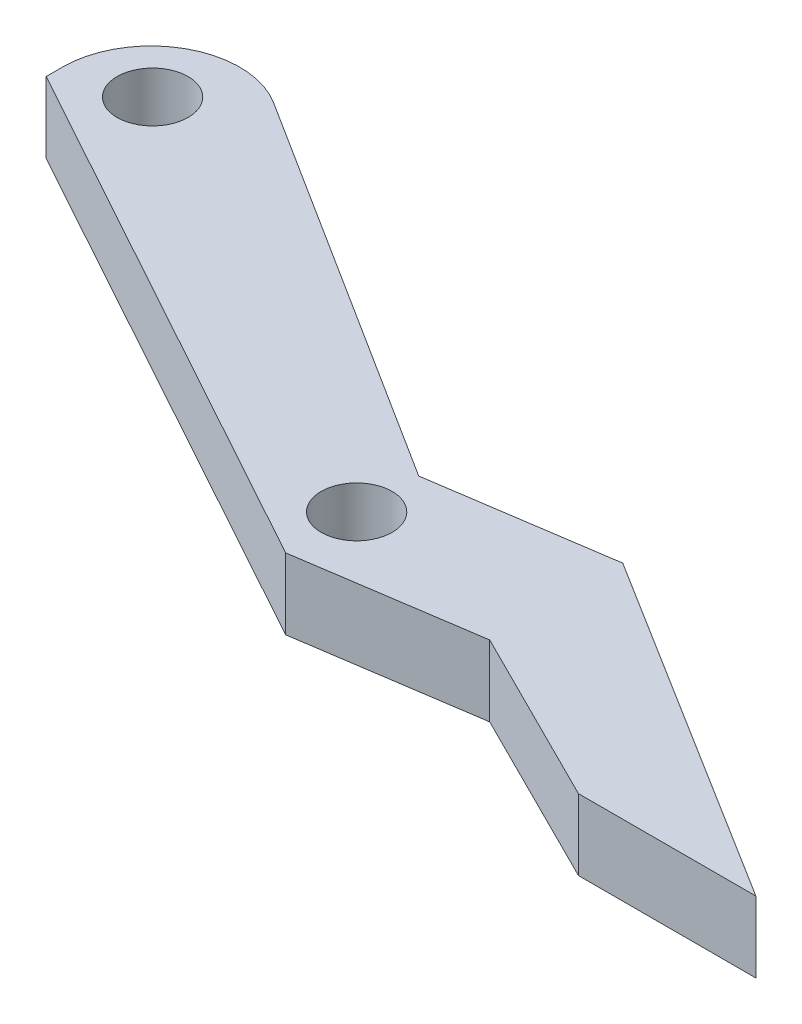
ISO-10303-21;
HEADER;
FILE_DESCRIPTION(('STEP AP214'),'2;1');
FILE_NAME('part.step','',(''),(''),'','','');
FILE_SCHEMA(('AUTOMOTIVE_DESIGN { 1 0 10303 214 1 1 1 1 }'));
ENDSEC;
DATA;
#1=APPLICATION_CONTEXT('core data for automotive mechanical design processes');
#2=APPLICATION_PROTOCOL_DEFINITION('international standard','automotive_design',2000,#1);
#3=PRODUCT_CONTEXT('',#1,'mechanical');
#4=PRODUCT('Part','Part','',(#3));
#5=PRODUCT_RELATED_PRODUCT_CATEGORY('part','',(#4));
#6=PRODUCT_DEFINITION_FORMATION('','',#4);
#7=PRODUCT_DEFINITION_CONTEXT('part definition',#1,'design');
#8=PRODUCT_DEFINITION('design','',#6,#7);
#9=PRODUCT_DEFINITION_SHAPE('','',#8);
#10=(LENGTH_UNIT() NAMED_UNIT(*) SI_UNIT(.MILLI.,.METRE.));
#11=(NAMED_UNIT(*) PLANE_ANGLE_UNIT() SI_UNIT($,.RADIAN.));
#12=(NAMED_UNIT(*) SI_UNIT($,.STERADIAN.) SOLID_ANGLE_UNIT());
#13=UNCERTAINTY_MEASURE_WITH_UNIT(LENGTH_MEASURE(1.E-05),#10,'distance_accuracy_value','');
#14=(GEOMETRIC_REPRESENTATION_CONTEXT(3) GLOBAL_UNCERTAINTY_ASSIGNED_CONTEXT((#13)) GLOBAL_UNIT_ASSIGNED_CONTEXT((#10,
#11,#12)) REPRESENTATION_CONTEXT('',''));
#15=CARTESIAN_POINT('',(0.,0.,0.));
#16=DIRECTION('',(0.,0.,1.));
#17=DIRECTION('',(1.,0.,0.));
#18=AXIS2_PLACEMENT_3D('',#15,#16,#17);
#19=CARTESIAN_POINT('',(0.,8.,0.));
#20=DIRECTION('',(0.,-1.,0.));
#21=DIRECTION('',(0.,0.,-1.));
#22=AXIS2_PLACEMENT_3D('',#19,#20,#21);
#23=PLANE('',#22);
#24=DIRECTION('',(-0.844819075554229,0.,-0.535052081184345));
#25=VECTOR('',#24,1.);
#26=CARTESIAN_POINT('',(0.,8.,-60.));
#27=LINE('',#26,#25);
#28=CARTESIAN_POINT('',(60.,8.,-22.));
#29=VERTEX_POINT('',#28);
#30=CARTESIAN_POINT('',(15.3505208118433,8.,-50.2780034858326));
#31=VERTEX_POINT('',#30);
#32=EDGE_CURVE('E125',#29,#31,#27,.T.);
#33=ORIENTED_EDGE('',*,*,#32,.T.);
#34=CARTESIAN_POINT('',(9.99999999999987,8.,-41.8298127302903));
#35=DIRECTION('',(0.,-1.,0.));
#36=DIRECTION('',(0.,0.,-1.));
#37=AXIS2_PLACEMENT_3D('',#34,#35,#36);
#38=CIRCLE('',#37,10.);
#39=CARTESIAN_POINT('',(-1.29312687655997E-13,8.,-41.8298127302903));
#40=VERTEX_POINT('',#39);
#41=EDGE_CURVE('E11',#31,#40,#38,.F.);
#42=ORIENTED_EDGE('',*,*,#41,.T.);
#43=DIRECTION('',(0.,0.,1.));
#44=VECTOR('',#43,1.);
#45=CARTESIAN_POINT('',(0.,8.,-60.));
#46=LINE('',#45,#44);
#47=CARTESIAN_POINT('',(-1.42125352285694E-13,8.,-40.0000000000001));
#48=VERTEX_POINT('',#47);
#49=EDGE_CURVE('E206',#40,#48,#46,.T.);
#50=ORIENTED_EDGE('',*,*,#49,.T.);
#51=DIRECTION('',(0.876215908676647,0.,0.481918749772156));
#52=VECTOR('',#51,1.);
#53=CARTESIAN_POINT('',(-1.42125352285694E-13,8.,-40.0000000000001));
#54=LINE('',#53,#52);
#55=CARTESIAN_POINT('',(60.,8.,-7.));
#56=VERTEX_POINT('',#55);
#57=EDGE_CURVE('E203',#48,#56,#54,.T.);
#58=ORIENTED_EDGE('',*,*,#57,.T.);
#59=DIRECTION('',(0.988936352868298,0.,-0.148340452930245));
#60=VECTOR('',#59,1.);
#61=CARTESIAN_POINT('',(80.,8.,-10.));
#62=LINE('',#61,#60);
#63=CARTESIAN_POINT('',(80.,8.,-10.));
#64=VERTEX_POINT('',#63);
#65=EDGE_CURVE('E200',#56,#64,#62,.T.);
#66=ORIENTED_EDGE('',*,*,#65,.T.);
#67=DIRECTION('',(0.894427190999916,0.,0.447213595499958));
#68=VECTOR('',#67,1.);
#69=CARTESIAN_POINT('',(100.,8.,0.));
#70=LINE('',#69,#68);
#71=CARTESIAN_POINT('',(100.,8.,0.));
#72=VERTEX_POINT('',#71);
#73=EDGE_CURVE('E197',#64,#72,#70,.T.);
#74=ORIENTED_EDGE('',*,*,#73,.T.);
#75=DIRECTION('',(1.,0.,0.));
#76=VECTOR('',#75,1.);
#77=CARTESIAN_POINT('',(120.,8.,0.));
#78=LINE('',#77,#76);
#79=CARTESIAN_POINT('',(120.,8.,0.));
#80=VERTEX_POINT('',#79);
#81=EDGE_CURVE('E131',#72,#80,#78,.T.);
#82=ORIENTED_EDGE('',*,*,#81,.T.);
#83=DIRECTION('',(-0.847998304005088,0.,-0.52999894000318));
#84=VECTOR('',#83,1.);
#85=CARTESIAN_POINT('',(80.,8.,-25.));
#86=LINE('',#85,#84);
#87=CARTESIAN_POINT('',(80.,8.,-25.));
#88=VERTEX_POINT('',#87);
#89=EDGE_CURVE('E126',#80,#88,#86,.T.);
#90=ORIENTED_EDGE('',*,*,#89,.T.);
#91=DIRECTION('',(-0.988936352868298,0.,0.148340452930245));
#92=VECTOR('',#91,1.);
#93=CARTESIAN_POINT('',(60.,8.,-22.));
#94=LINE('',#93,#92);
#95=EDGE_CURVE('E115',#88,#29,#94,.T.);
#96=ORIENTED_EDGE('',*,*,#95,.T.);
#97=EDGE_LOOP('',(#33,#42,#50,#58,#66,#74,#82,#90,#96));
#98=FACE_BOUND('',#97,.T.);
#99=CARTESIAN_POINT('',(60.,8.,-15.));
#100=DIRECTION('',(0.,1.,0.));
#101=DIRECTION('',(0.,0.,1.));
#102=AXIS2_PLACEMENT_3D('',#99,#100,#101);
#103=CIRCLE('',#102,4.00000000000001);
#104=CARTESIAN_POINT('',(60.,8.,-11.));
#105=VERTEX_POINT('',#104);
#106=EDGE_CURVE('E194',#105,#105,#103,.T.);
#107=ORIENTED_EDGE('',*,*,#106,.F.);
#108=EDGE_LOOP('',(#107));
#109=FACE_BOUND('',#108,.T.);
#110=CARTESIAN_POINT('',(7.99999999999986,8.,-44.));
#111=DIRECTION('',(0.,1.,0.));
#112=DIRECTION('',(0.,0.,1.));
#113=AXIS2_PLACEMENT_3D('',#110,#111,#112);
#114=CIRCLE('',#113,4.);
#115=CARTESIAN_POINT('',(7.99999999999986,8.,-40.));
#116=VERTEX_POINT('',#115);
#117=EDGE_CURVE('E215',#116,#116,#114,.T.);
#118=ORIENTED_EDGE('',*,*,#117,.F.);
#119=EDGE_LOOP('',(#118));
#120=FACE_BOUND('',#119,.T.);
#121=ADVANCED_FACE('F43',(#98,#109,#120),#23,.F.);
#122=CARTESIAN_POINT('',(0.,0.,0.));
#123=DIRECTION('',(0.,-1.,0.));
#124=DIRECTION('',(0.,0.,-1.));
#125=AXIS2_PLACEMENT_3D('',#122,#123,#124);
#126=PLANE('',#125);
#127=CARTESIAN_POINT('',(60.,0.,-15.));
#128=DIRECTION('',(0.,1.,0.));
#129=DIRECTION('',(0.,0.,1.));
#130=AXIS2_PLACEMENT_3D('',#127,#128,#129);
#131=CIRCLE('',#130,4.00000000000001);
#132=CARTESIAN_POINT('',(60.,0.,-11.));
#133=VERTEX_POINT('',#132);
#134=EDGE_CURVE('E211',#133,#133,#131,.T.);
#135=ORIENTED_EDGE('',*,*,#134,.T.);
#136=EDGE_LOOP('',(#135));
#137=FACE_BOUND('',#136,.T.);
#138=DIRECTION('',(0.,0.,1.));
#139=VECTOR('',#138,1.);
#140=CARTESIAN_POINT('',(0.,0.,-60.));
#141=LINE('',#140,#139);
#142=CARTESIAN_POINT('',(-1.29312687655997E-13,0.,-41.8298127302903));
#143=VERTEX_POINT('',#142);
#144=CARTESIAN_POINT('',(-1.42125352285694E-13,0.,-40.0000000000001));
#145=VERTEX_POINT('',#144);
#146=EDGE_CURVE('E183',#143,#145,#141,.T.);
#147=ORIENTED_EDGE('',*,*,#146,.F.);
#148=CARTESIAN_POINT('',(9.99999999999987,0.,-41.8298127302903));
#149=DIRECTION('',(0.,-1.,0.));
#150=DIRECTION('',(0.,0.,-1.));
#151=AXIS2_PLACEMENT_3D('',#148,#149,#150);
#152=CIRCLE('',#151,10.);
#153=CARTESIAN_POINT('',(15.3505208118433,0.,-50.2780034858326));
#154=VERTEX_POINT('',#153);
#155=EDGE_CURVE('E66',#143,#154,#152,.T.);
#156=ORIENTED_EDGE('',*,*,#155,.T.);
#157=DIRECTION('',(-0.844819075554229,0.,-0.535052081184345));
#158=VECTOR('',#157,1.);
#159=CARTESIAN_POINT('',(0.,0.,-60.));
#160=LINE('',#159,#158);
#161=CARTESIAN_POINT('',(60.,0.,-22.));
#162=VERTEX_POINT('',#161);
#163=EDGE_CURVE('E186',#162,#154,#160,.T.);
#164=ORIENTED_EDGE('',*,*,#163,.F.);
#165=DIRECTION('',(-0.988936352868298,0.,0.148340452930245));
#166=VECTOR('',#165,1.);
#167=CARTESIAN_POINT('',(60.,0.,-22.));
#168=LINE('',#167,#166);
#169=CARTESIAN_POINT('',(80.,0.,-25.));
#170=VERTEX_POINT('',#169);
#171=EDGE_CURVE('E189',#170,#162,#168,.T.);
#172=ORIENTED_EDGE('',*,*,#171,.F.);
#173=DIRECTION('',(-0.847998304005088,0.,-0.52999894000318));
#174=VECTOR('',#173,1.);
#175=CARTESIAN_POINT('',(80.,0.,-25.));
#176=LINE('',#175,#174);
#177=CARTESIAN_POINT('',(120.,0.,0.));
#178=VERTEX_POINT('',#177);
#179=EDGE_CURVE('E140',#178,#170,#176,.T.);
#180=ORIENTED_EDGE('',*,*,#179,.F.);
#181=DIRECTION('',(1.,0.,0.));
#182=VECTOR('',#181,1.);
#183=CARTESIAN_POINT('',(120.,0.,0.));
#184=LINE('',#183,#182);
#185=CARTESIAN_POINT('',(100.,0.,0.));
#186=VERTEX_POINT('',#185);
#187=EDGE_CURVE('E136',#186,#178,#184,.T.);
#188=ORIENTED_EDGE('',*,*,#187,.F.);
#189=DIRECTION('',(0.894427190999916,0.,0.447213595499958));
#190=VECTOR('',#189,1.);
#191=CARTESIAN_POINT('',(100.,0.,0.));
#192=LINE('',#191,#190);
#193=CARTESIAN_POINT('',(80.,0.,-10.));
#194=VERTEX_POINT('',#193);
#195=EDGE_CURVE('E174',#194,#186,#192,.T.);
#196=ORIENTED_EDGE('',*,*,#195,.F.);
#197=DIRECTION('',(0.988936352868298,0.,-0.148340452930245));
#198=VECTOR('',#197,1.);
#199=CARTESIAN_POINT('',(80.,0.,-10.));
#200=LINE('',#199,#198);
#201=CARTESIAN_POINT('',(60.,0.,-7.));
#202=VERTEX_POINT('',#201);
#203=EDGE_CURVE('E177',#202,#194,#200,.T.);
#204=ORIENTED_EDGE('',*,*,#203,.F.);
#205=DIRECTION('',(0.876215908676647,0.,0.481918749772156));
#206=VECTOR('',#205,1.);
#207=CARTESIAN_POINT('',(-1.42125352285694E-13,0.,-40.0000000000001));
#208=LINE('',#207,#206);
#209=EDGE_CURVE('E180',#145,#202,#208,.T.);
#210=ORIENTED_EDGE('',*,*,#209,.F.);
#211=EDGE_LOOP('',(#147,#156,#164,#172,#180,#188,#196,#204,#210));
#212=FACE_BOUND('',#211,.T.);
#213=CARTESIAN_POINT('',(7.99999999999986,0.,-44.));
#214=DIRECTION('',(0.,1.,0.));
#215=DIRECTION('',(0.,0.,1.));
#216=AXIS2_PLACEMENT_3D('',#213,#214,#215);
#217=CIRCLE('',#216,4.);
#218=CARTESIAN_POINT('',(7.99999999999986,0.,-40.));
#219=VERTEX_POINT('',#218);
#220=EDGE_CURVE('E219',#219,#219,#217,.T.);
#221=ORIENTED_EDGE('',*,*,#220,.T.);
#222=EDGE_LOOP('',(#221));
#223=FACE_BOUND('',#222,.T.);
#224=ADVANCED_FACE('F231',(#137,#212,#223),#126,.T.);
#225=CARTESIAN_POINT('',(80.,8.,-25.));
#226=DIRECTION('',(-0.52999894000318,0.,0.847998304005088));
#227=DIRECTION('',(0.847998304005088,0.,0.52999894000318));
#228=AXIS2_PLACEMENT_3D('',#225,#226,#227);
#229=PLANE('',#228);
#230=ORIENTED_EDGE('',*,*,#179,.T.);
#231=DIRECTION('',(0.,-1.,0.));
#232=VECTOR('',#231,1.);
#233=CARTESIAN_POINT('',(80.,8.,-25.));
#234=LINE('',#233,#232);
#235=EDGE_CURVE('E119',#88,#170,#234,.T.);
#236=ORIENTED_EDGE('',*,*,#235,.F.);
#237=ORIENTED_EDGE('',*,*,#89,.F.);
#238=DIRECTION('',(0.,-1.,0.));
#239=VECTOR('',#238,1.);
#240=CARTESIAN_POINT('',(120.,8.,0.));
#241=LINE('',#240,#239);
#242=EDGE_CURVE('E169',#80,#178,#241,.T.);
#243=ORIENTED_EDGE('',*,*,#242,.T.);
#244=EDGE_LOOP('',(#230,#236,#237,#243));
#245=FACE_BOUND('',#244,.T.);
#246=ADVANCED_FACE('F138',(#245),#229,.F.);
#247=CARTESIAN_POINT('',(60.,8.,-22.));
#248=DIRECTION('',(0.148340452930245,0.,0.988936352868298));
#249=DIRECTION('',(0.988936352868298,0.,-0.148340452930245));
#250=AXIS2_PLACEMENT_3D('',#247,#248,#249);
#251=PLANE('',#250);
#252=ORIENTED_EDGE('',*,*,#171,.T.);
#253=DIRECTION('',(0.,-1.,0.));
#254=VECTOR('',#253,1.);
#255=CARTESIAN_POINT('',(60.,8.,-22.));
#256=LINE('',#255,#254);
#257=EDGE_CURVE('E122',#29,#162,#256,.T.);
#258=ORIENTED_EDGE('',*,*,#257,.F.);
#259=ORIENTED_EDGE('',*,*,#95,.F.);
#260=ORIENTED_EDGE('',*,*,#235,.T.);
#261=EDGE_LOOP('',(#252,#258,#259,#260));
#262=FACE_BOUND('',#261,.T.);
#263=ADVANCED_FACE('F117',(#262),#251,.F.);
#264=CARTESIAN_POINT('',(0.,8.,-60.));
#265=DIRECTION('',(-0.535052081184345,0.,0.844819075554229));
#266=DIRECTION('',(0.844819075554229,0.,0.535052081184345));
#267=AXIS2_PLACEMENT_3D('',#264,#265,#266);
#268=PLANE('',#267);
#269=ORIENTED_EDGE('',*,*,#163,.T.);
#270=DIRECTION('',(0.,-1.,0.));
#271=VECTOR('',#270,1.);
#272=CARTESIAN_POINT('',(15.3505208118433,8.,-50.2780034858326));
#273=LINE('',#272,#271);
#274=EDGE_CURVE('E52',#154,#31,#273,.F.);
#275=ORIENTED_EDGE('',*,*,#274,.T.);
#276=ORIENTED_EDGE('',*,*,#32,.F.);
#277=ORIENTED_EDGE('',*,*,#257,.T.);
#278=EDGE_LOOP('',(#269,#275,#276,#277));
#279=FACE_BOUND('',#278,.T.);
#280=ADVANCED_FACE('F262',(#279),#268,.F.);
#281=CARTESIAN_POINT('',(0.,8.,-60.));
#282=DIRECTION('',(1.,0.,0.));
#283=DIRECTION('',(0.,0.,-1.));
#284=AXIS2_PLACEMENT_3D('',#281,#282,#283);
#285=PLANE('',#284);
#286=ORIENTED_EDGE('',*,*,#49,.F.);
#287=DIRECTION('',(0.,-1.,0.));
#288=VECTOR('',#287,1.);
#289=CARTESIAN_POINT('',(-1.29312687655997E-13,8.,-41.8298127302903));
#290=LINE('',#289,#288);
#291=EDGE_CURVE('E142',#40,#143,#290,.T.);
#292=ORIENTED_EDGE('',*,*,#291,.T.);
#293=ORIENTED_EDGE('',*,*,#146,.T.);
#294=DIRECTION('',(0.,-1.,0.));
#295=VECTOR('',#294,1.);
#296=CARTESIAN_POINT('',(-1.42125352285694E-13,8.,-40.0000000000001));
#297=LINE('',#296,#295);
#298=EDGE_CURVE('E148',#48,#145,#297,.T.);
#299=ORIENTED_EDGE('',*,*,#298,.F.);
#300=EDGE_LOOP('',(#286,#292,#293,#299));
#301=FACE_BOUND('',#300,.T.);
#302=ADVANCED_FACE('F258',(#301),#285,.F.);
#303=CARTESIAN_POINT('',(-1.42125352285694E-13,8.,-40.0000000000001));
#304=DIRECTION('',(0.481918749772156,0.,-0.876215908676647));
#305=DIRECTION('',(-0.876215908676647,0.,-0.481918749772156));
#306=AXIS2_PLACEMENT_3D('',#303,#304,#305);
#307=PLANE('',#306);
#308=ORIENTED_EDGE('',*,*,#209,.T.);
#309=DIRECTION('',(0.,-1.,0.));
#310=VECTOR('',#309,1.);
#311=CARTESIAN_POINT('',(60.,8.,-7.));
#312=LINE('',#311,#310);
#313=EDGE_CURVE('E157',#56,#202,#312,.T.);
#314=ORIENTED_EDGE('',*,*,#313,.F.);
#315=ORIENTED_EDGE('',*,*,#57,.F.);
#316=ORIENTED_EDGE('',*,*,#298,.T.);
#317=EDGE_LOOP('',(#308,#314,#315,#316));
#318=FACE_BOUND('',#317,.T.);
#319=ADVANCED_FACE('F254',(#318),#307,.F.);
#320=CARTESIAN_POINT('',(80.,8.,-10.));
#321=DIRECTION('',(-0.148340452930245,0.,-0.988936352868298));
#322=DIRECTION('',(-0.988936352868298,0.,0.148340452930245));
#323=AXIS2_PLACEMENT_3D('',#320,#321,#322);
#324=PLANE('',#323);
#325=ORIENTED_EDGE('',*,*,#203,.T.);
#326=DIRECTION('',(0.,-1.,0.));
#327=VECTOR('',#326,1.);
#328=CARTESIAN_POINT('',(80.,8.,-10.));
#329=LINE('',#328,#327);
#330=EDGE_CURVE('E161',#64,#194,#329,.T.);
#331=ORIENTED_EDGE('',*,*,#330,.F.);
#332=ORIENTED_EDGE('',*,*,#65,.F.);
#333=ORIENTED_EDGE('',*,*,#313,.T.);
#334=EDGE_LOOP('',(#325,#331,#332,#333));
#335=FACE_BOUND('',#334,.T.);
#336=ADVANCED_FACE('F250',(#335),#324,.F.);
#337=CARTESIAN_POINT('',(100.,8.,0.));
#338=DIRECTION('',(0.447213595499958,0.,-0.894427190999916));
#339=DIRECTION('',(-0.894427190999916,0.,-0.447213595499958));
#340=AXIS2_PLACEMENT_3D('',#337,#338,#339);
#341=PLANE('',#340);
#342=ORIENTED_EDGE('',*,*,#195,.T.);
#343=DIRECTION('',(0.,-1.,0.));
#344=VECTOR('',#343,1.);
#345=CARTESIAN_POINT('',(100.,8.,0.));
#346=LINE('',#345,#344);
#347=EDGE_CURVE('E165',#72,#186,#346,.T.);
#348=ORIENTED_EDGE('',*,*,#347,.F.);
#349=ORIENTED_EDGE('',*,*,#73,.F.);
#350=ORIENTED_EDGE('',*,*,#330,.T.);
#351=EDGE_LOOP('',(#342,#348,#349,#350));
#352=FACE_BOUND('',#351,.T.);
#353=ADVANCED_FACE('F246',(#352),#341,.F.);
#354=CARTESIAN_POINT('',(120.,8.,0.));
#355=DIRECTION('',(0.,0.,-1.));
#356=DIRECTION('',(-1.,0.,0.));
#357=AXIS2_PLACEMENT_3D('',#354,#355,#356);
#358=PLANE('',#357);
#359=ORIENTED_EDGE('',*,*,#187,.T.);
#360=ORIENTED_EDGE('',*,*,#242,.F.);
#361=ORIENTED_EDGE('',*,*,#81,.F.);
#362=ORIENTED_EDGE('',*,*,#347,.T.);
#363=EDGE_LOOP('',(#359,#360,#361,#362));
#364=FACE_BOUND('',#363,.T.);
#365=ADVANCED_FACE('F243',(#364),#358,.F.);
#366=CARTESIAN_POINT('',(60.,8.,-15.));
#367=DIRECTION('',(0.,-1.,0.));
#368=DIRECTION('',(0.,0.,-1.));
#369=AXIS2_PLACEMENT_3D('',#366,#367,#368);
#370=CYLINDRICAL_SURFACE('',#369,4.00000000000001);
#371=ORIENTED_EDGE('',*,*,#106,.T.);
#372=EDGE_LOOP('',(#371));
#373=FACE_BOUND('',#372,.T.);
#374=ORIENTED_EDGE('',*,*,#134,.F.);
#375=EDGE_LOOP('',(#374));
#376=FACE_BOUND('',#375,.T.);
#377=ADVANCED_FACE('F240',(#373,#376),#370,.F.);
#378=CARTESIAN_POINT('',(7.99999999999986,8.,-44.));
#379=DIRECTION('',(0.,-1.,0.));
#380=DIRECTION('',(0.,0.,-1.));
#381=AXIS2_PLACEMENT_3D('',#378,#379,#380);
#382=CYLINDRICAL_SURFACE('',#381,4.);
#383=ORIENTED_EDGE('',*,*,#117,.T.);
#384=EDGE_LOOP('',(#383));
#385=FACE_BOUND('',#384,.T.);
#386=ORIENTED_EDGE('',*,*,#220,.F.);
#387=EDGE_LOOP('',(#386));
#388=FACE_BOUND('',#387,.T.);
#389=ADVANCED_FACE('F227',(#385,#388),#382,.F.);
#390=CARTESIAN_POINT('',(9.99999999999987,8.,-41.8298127302903));
#391=DIRECTION('',(0.,-1.,0.));
#392=DIRECTION('',(0.,0.,-1.));
#393=AXIS2_PLACEMENT_3D('',#390,#391,#392);
#394=CYLINDRICAL_SURFACE('',#393,10.);
#395=ORIENTED_EDGE('',*,*,#41,.F.);
#396=ORIENTED_EDGE('',*,*,#274,.F.);
#397=ORIENTED_EDGE('',*,*,#155,.F.);
#398=ORIENTED_EDGE('',*,*,#291,.F.);
#399=EDGE_LOOP('',(#395,#396,#397,#398));
#400=FACE_BOUND('',#399,.T.);
#401=ADVANCED_FACE('F45',(#400),#394,.T.);
#402=CLOSED_SHELL('',(#121,#224,#246,#263,#280,#302,#319,#336,#353,#365,#377,#389,#401));
#403=MANIFOLD_SOLID_BREP('B2',#402);
#404=ADVANCED_BREP_SHAPE_REPRESENTATION('',(#18,#403),#14);
#405=SHAPE_DEFINITION_REPRESENTATION(#9,#404);
ENDSEC;
END-ISO-10303-21;
